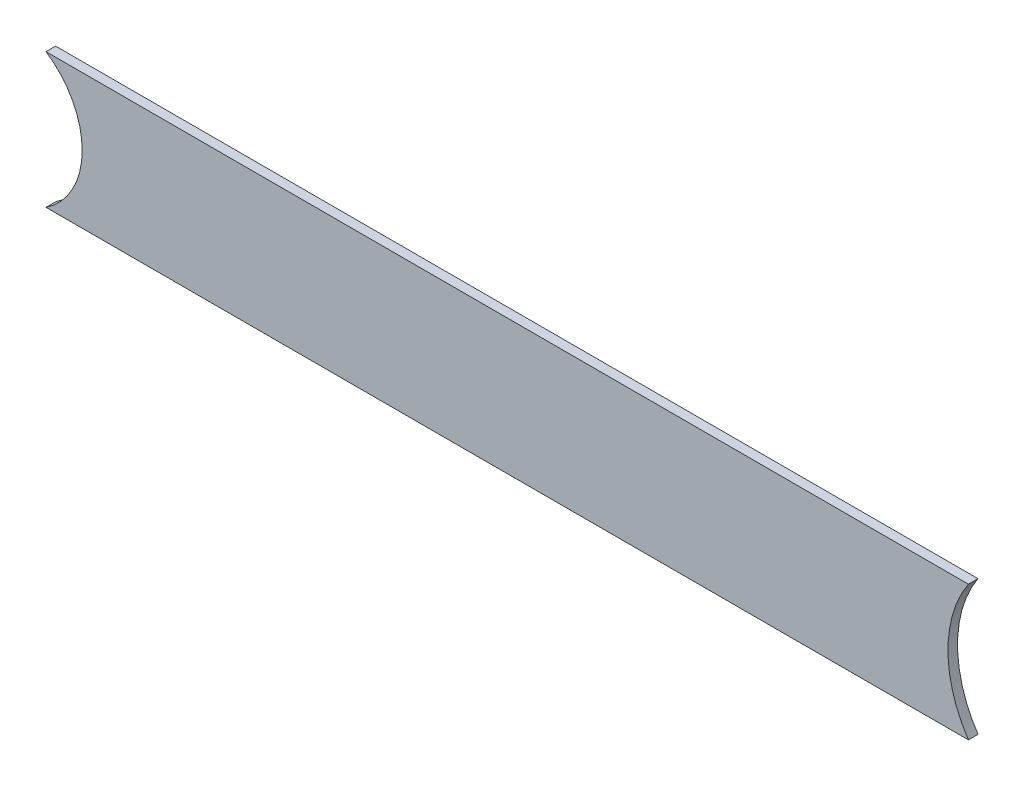
ISO-10303-21;
HEADER;
FILE_DESCRIPTION(('STEP AP214'),'2;1');
FILE_NAME('part.step','',(''),(''),'','','');
FILE_SCHEMA(('AUTOMOTIVE_DESIGN { 1 0 10303 214 1 1 1 1 }'));
ENDSEC;
DATA;
#1=APPLICATION_CONTEXT('core data for automotive mechanical design processes');
#2=APPLICATION_PROTOCOL_DEFINITION('international standard','automotive_design',2000,#1);
#3=PRODUCT_CONTEXT('',#1,'mechanical');
#4=PRODUCT('Part','Part','',(#3));
#5=PRODUCT_RELATED_PRODUCT_CATEGORY('part','',(#4));
#6=PRODUCT_DEFINITION_FORMATION('','',#4);
#7=PRODUCT_DEFINITION_CONTEXT('part definition',#1,'design');
#8=PRODUCT_DEFINITION('design','',#6,#7);
#9=PRODUCT_DEFINITION_SHAPE('','',#8);
#10=(LENGTH_UNIT() NAMED_UNIT(*) SI_UNIT(.MILLI.,.METRE.));
#11=(NAMED_UNIT(*) PLANE_ANGLE_UNIT() SI_UNIT($,.RADIAN.));
#12=(NAMED_UNIT(*) SI_UNIT($,.STERADIAN.) SOLID_ANGLE_UNIT());
#13=UNCERTAINTY_MEASURE_WITH_UNIT(LENGTH_MEASURE(1.E-05),#10,'distance_accuracy_value','');
#14=(GEOMETRIC_REPRESENTATION_CONTEXT(3) GLOBAL_UNCERTAINTY_ASSIGNED_CONTEXT((#13)) GLOBAL_UNIT_ASSIGNED_CONTEXT((#10,
#11,#12)) REPRESENTATION_CONTEXT('',''));
#15=CARTESIAN_POINT('',(0.,0.,0.));
#16=DIRECTION('',(0.,0.,1.));
#17=DIRECTION('',(1.,0.,0.));
#18=AXIS2_PLACEMENT_3D('',#15,#16,#17);
#19=CARTESIAN_POINT('',(43.5658457078553,48.2499797,0.));
#20=DIRECTION('',(0.,1.,0.));
#21=DIRECTION('',(1.,0.,0.));
#22=AXIS2_PLACEMENT_3D('',#19,#20,#21);
#23=PLANE('',#22);
#24=DIRECTION('',(1.,0.,0.));
#25=VECTOR('',#24,1.);
#26=CARTESIAN_POINT('',(43.4000148,48.2499797,0.03556));
#27=LINE('',#26,#25);
#28=CARTESIAN_POINT('',(43.5658457078553,48.2499797,0.03556));
#29=VERTEX_POINT('',#28);
#30=CARTESIAN_POINT('',(46.9858114096541,48.2499797,0.03556));
#31=VERTEX_POINT('',#30);
#32=EDGE_CURVE('E11',#29,#31,#27,.T.);
#33=ORIENTED_EDGE('',*,*,#32,.F.);
#34=DIRECTION('',(0.,0.,1.));
#35=VECTOR('',#34,1.);
#36=CARTESIAN_POINT('',(43.5658457078553,48.2499797,0.));
#37=LINE('',#36,#35);
#38=CARTESIAN_POINT('',(43.5658457078553,48.2499797,0.));
#39=VERTEX_POINT('',#38);
#40=EDGE_CURVE('E24',#39,#29,#37,.T.);
#41=ORIENTED_EDGE('',*,*,#40,.F.);
#42=DIRECTION('',(1.,0.,0.));
#43=VECTOR('',#42,1.);
#44=CARTESIAN_POINT('',(43.4000148,48.2499797,0.));
#45=LINE('',#44,#43);
#46=CARTESIAN_POINT('',(46.9858114096541,48.2499797,0.));
#47=VERTEX_POINT('',#46);
#48=EDGE_CURVE('E82',#39,#47,#45,.T.);
#49=ORIENTED_EDGE('',*,*,#48,.T.);
#50=DIRECTION('',(0.,0.,1.));
#51=VECTOR('',#50,1.);
#52=CARTESIAN_POINT('',(46.9858114096541,48.2499797,0.));
#53=LINE('',#52,#51);
#54=EDGE_CURVE('E37',#47,#31,#53,.T.);
#55=ORIENTED_EDGE('',*,*,#54,.T.);
#56=EDGE_LOOP('',(#33,#41,#49,#55));
#57=FACE_BOUND('',#56,.T.);
#58=ADVANCED_FACE('F17',(#57),#23,.F.);
#59=CARTESIAN_POINT('',(47.3599764,48.4999792,0.));
#60=DIRECTION('',(0.,0.,-1.));
#61=DIRECTION('',(1.,0.,0.));
#62=AXIS2_PLACEMENT_3D('',#59,#60,#61);
#63=CYLINDRICAL_SURFACE('',#62,0.4499991);
#64=DIRECTION('',(0.,0.,1.));
#65=VECTOR('',#64,1.);
#66=CARTESIAN_POINT('',(46.9858114096541,48.7499787,0.));
#67=LINE('',#66,#65);
#68=CARTESIAN_POINT('',(46.9858114096541,48.7499787,0.));
#69=VERTEX_POINT('',#68);
#70=CARTESIAN_POINT('',(46.9858114096541,48.7499787,0.03556));
#71=VERTEX_POINT('',#70);
#72=EDGE_CURVE('E97',#69,#71,#67,.T.);
#73=ORIENTED_EDGE('',*,*,#72,.T.);
#74=CARTESIAN_POINT('',(47.3599764,48.4999792,0.03556));
#75=DIRECTION('',(0.,0.,1.));
#76=DIRECTION('',(1.,0.,0.));
#77=AXIS2_PLACEMENT_3D('',#74,#75,#76);
#78=CIRCLE('',#77,0.4499991);
#79=EDGE_CURVE('E94',#71,#31,#78,.T.);
#80=ORIENTED_EDGE('',*,*,#79,.T.);
#81=ORIENTED_EDGE('',*,*,#54,.F.);
#82=CARTESIAN_POINT('',(47.3599764,48.4999792,0.));
#83=DIRECTION('',(0.,0.,1.));
#84=DIRECTION('',(1.,0.,0.));
#85=AXIS2_PLACEMENT_3D('',#82,#83,#84);
#86=CIRCLE('',#85,0.4499991);
#87=EDGE_CURVE('E92',#69,#47,#86,.T.);
#88=ORIENTED_EDGE('',*,*,#87,.F.);
#89=EDGE_LOOP('',(#73,#80,#81,#88));
#90=FACE_BOUND('',#89,.T.);
#91=ADVANCED_FACE('F102',(#90),#63,.F.);
#92=CARTESIAN_POINT('',(46.9858114096541,48.7499787,0.));
#93=DIRECTION('',(0.,-1.,0.));
#94=DIRECTION('',(-1.,0.,0.));
#95=AXIS2_PLACEMENT_3D('',#92,#93,#94);
#96=PLANE('',#95);
#97=DIRECTION('',(-1.,0.,0.));
#98=VECTOR('',#97,1.);
#99=CARTESIAN_POINT('',(47.3599764,48.7499787,0.03556));
#100=LINE('',#99,#98);
#101=CARTESIAN_POINT('',(43.5658457078553,48.7499787,0.03556));
#102=VERTEX_POINT('',#101);
#103=EDGE_CURVE('E89',#71,#102,#100,.T.);
#104=ORIENTED_EDGE('',*,*,#103,.F.);
#105=ORIENTED_EDGE('',*,*,#72,.F.);
#106=DIRECTION('',(-1.,0.,0.));
#107=VECTOR('',#106,1.);
#108=CARTESIAN_POINT('',(47.3599764,48.7499787,0.));
#109=LINE('',#108,#107);
#110=CARTESIAN_POINT('',(43.5658457078553,48.7499787,0.));
#111=VERTEX_POINT('',#110);
#112=EDGE_CURVE('E87',#69,#111,#109,.T.);
#113=ORIENTED_EDGE('',*,*,#112,.T.);
#114=DIRECTION('',(0.,0.,1.));
#115=VECTOR('',#114,1.);
#116=CARTESIAN_POINT('',(43.5658457078553,48.7499787,0.));
#117=LINE('',#116,#115);
#118=EDGE_CURVE('E69',#111,#102,#117,.T.);
#119=ORIENTED_EDGE('',*,*,#118,.T.);
#120=EDGE_LOOP('',(#104,#105,#113,#119));
#121=FACE_BOUND('',#120,.T.);
#122=ADVANCED_FACE('F108',(#121),#96,.F.);
#123=CARTESIAN_POINT('',(43.4000148,48.4999792,0.));
#124=DIRECTION('',(0.,0.,-1.));
#125=DIRECTION('',(1.,0.,0.));
#126=AXIS2_PLACEMENT_3D('',#123,#124,#125);
#127=CYLINDRICAL_SURFACE('',#126,0.2999994);
#128=DIRECTION('',(0.,0.,1.));
#129=VECTOR('',#128,1.);
#130=CARTESIAN_POINT('',(43.7000142,48.4999792,0.));
#131=LINE('',#130,#129);
#132=CARTESIAN_POINT('',(43.7000142,48.4999792,0.));
#133=VERTEX_POINT('',#132);
#134=CARTESIAN_POINT('',(43.7000142,48.4999792,0.03556));
#135=VERTEX_POINT('',#134);
#136=EDGE_CURVE('E59',#133,#135,#131,.T.);
#137=ORIENTED_EDGE('',*,*,#136,.T.);
#138=CARTESIAN_POINT('',(43.4000148,48.4999792,0.03556));
#139=DIRECTION('',(0.,0.,1.));
#140=DIRECTION('',(1.,0.,0.));
#141=AXIS2_PLACEMENT_3D('',#138,#139,#140);
#142=CIRCLE('',#141,0.2999994);
#143=EDGE_CURVE('E70',#135,#102,#142,.T.);
#144=ORIENTED_EDGE('',*,*,#143,.T.);
#145=ORIENTED_EDGE('',*,*,#118,.F.);
#146=CARTESIAN_POINT('',(43.4000148,48.4999792,0.));
#147=DIRECTION('',(0.,0.,1.));
#148=DIRECTION('',(1.,0.,0.));
#149=AXIS2_PLACEMENT_3D('',#146,#147,#148);
#150=CIRCLE('',#149,0.2999994);
#151=EDGE_CURVE('E73',#133,#111,#150,.T.);
#152=ORIENTED_EDGE('',*,*,#151,.F.);
#153=EDGE_LOOP('',(#137,#144,#145,#152));
#154=FACE_BOUND('',#153,.T.);
#155=ADVANCED_FACE('F74',(#154),#127,.F.);
#156=CARTESIAN_POINT('',(43.4000148,48.4999792,0.));
#157=DIRECTION('',(0.,0.,-1.));
#158=DIRECTION('',(1.,0.,0.));
#159=AXIS2_PLACEMENT_3D('',#156,#157,#158);
#160=CYLINDRICAL_SURFACE('',#159,0.2999994);
#161=ORIENTED_EDGE('',*,*,#40,.T.);
#162=CARTESIAN_POINT('',(43.4000148,48.4999792,0.03556));
#163=DIRECTION('',(0.,0.,1.));
#164=DIRECTION('',(1.,0.,0.));
#165=AXIS2_PLACEMENT_3D('',#162,#163,#164);
#166=CIRCLE('',#165,0.2999994);
#167=EDGE_CURVE('E65',#29,#135,#166,.T.);
#168=ORIENTED_EDGE('',*,*,#167,.T.);
#169=ORIENTED_EDGE('',*,*,#136,.F.);
#170=EDGE_CURVE('E63',#39,#133,#150,.T.);
#171=ORIENTED_EDGE('',*,*,#170,.F.);
#172=EDGE_LOOP('',(#161,#168,#169,#171));
#173=FACE_BOUND('',#172,.T.);
#174=ADVANCED_FACE('F61',(#173),#160,.F.);
#175=CARTESIAN_POINT('',(43.4000148,48.2499797,0.));
#176=DIRECTION('',(0.,0.,-1.));
#177=DIRECTION('',(-1.,0.,0.));
#178=AXIS2_PLACEMENT_3D('',#175,#176,#177);
#179=PLANE('',#178);
#180=ORIENTED_EDGE('',*,*,#48,.F.);
#181=ORIENTED_EDGE('',*,*,#170,.T.);
#182=ORIENTED_EDGE('',*,*,#151,.T.);
#183=ORIENTED_EDGE('',*,*,#112,.F.);
#184=ORIENTED_EDGE('',*,*,#87,.T.);
#185=EDGE_LOOP('',(#180,#181,#182,#183,#184));
#186=FACE_BOUND('',#185,.T.);
#187=ADVANCED_FACE('F80',(#186),#179,.T.);
#188=CARTESIAN_POINT('',(43.4000148,48.2499797,0.03556));
#189=DIRECTION('',(0.,0.,-1.));
#190=DIRECTION('',(-1.,0.,0.));
#191=AXIS2_PLACEMENT_3D('',#188,#189,#190);
#192=PLANE('',#191);
#193=ORIENTED_EDGE('',*,*,#167,.F.);
#194=ORIENTED_EDGE('',*,*,#32,.T.);
#195=ORIENTED_EDGE('',*,*,#79,.F.);
#196=ORIENTED_EDGE('',*,*,#103,.T.);
#197=ORIENTED_EDGE('',*,*,#143,.F.);
#198=EDGE_LOOP('',(#193,#194,#195,#196,#197));
#199=FACE_BOUND('',#198,.T.);
#200=ADVANCED_FACE('F106',(#199),#192,.F.);
#201=CLOSED_SHELL('',(#58,#91,#122,#155,#174,#187,#200));
#202=MANIFOLD_SOLID_BREP('B1',#201);
#203=ADVANCED_BREP_SHAPE_REPRESENTATION('',(#18,#202),#14);
#204=SHAPE_DEFINITION_REPRESENTATION(#9,#203);
ENDSEC;
END-ISO-10303-21;
